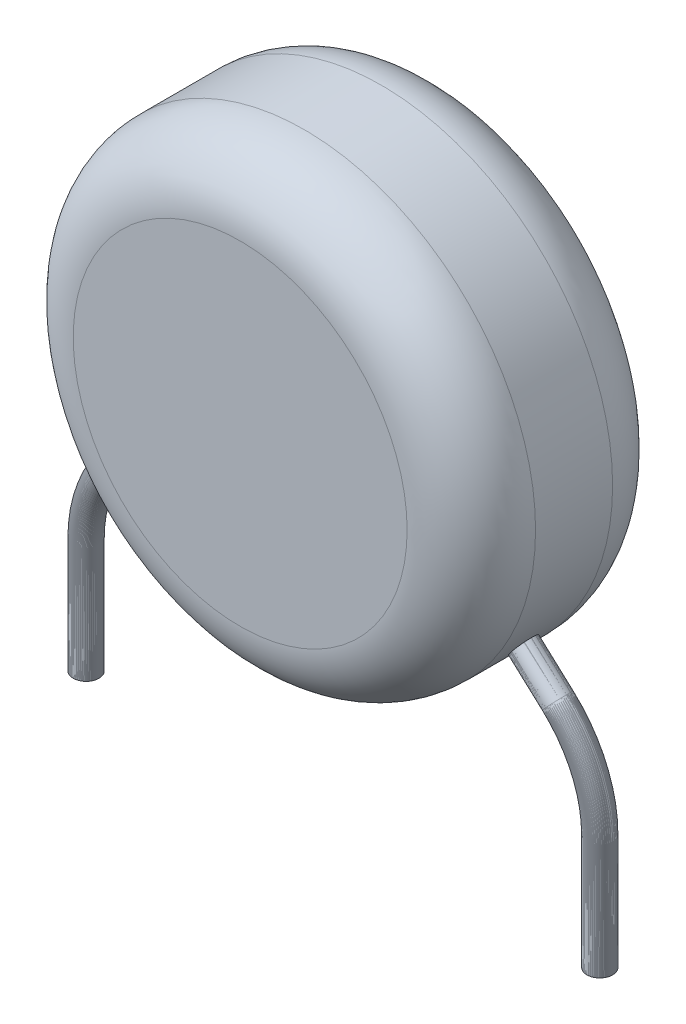
ISO-10303-21;
HEADER;
FILE_DESCRIPTION(('STEP AP214'),'2;1');
FILE_NAME('part.step','',(''),(''),'','','');
FILE_SCHEMA(('AUTOMOTIVE_DESIGN { 1 0 10303 214 1 1 1 1 }'));
ENDSEC;
DATA;
#1=APPLICATION_CONTEXT('core data for automotive mechanical design processes');
#2=APPLICATION_PROTOCOL_DEFINITION('international standard','automotive_design',2000,#1);
#3=PRODUCT_CONTEXT('',#1,'mechanical');
#4=PRODUCT('Part','Part','',(#3));
#5=PRODUCT_RELATED_PRODUCT_CATEGORY('part','',(#4));
#6=PRODUCT_DEFINITION_FORMATION('','',#4);
#7=PRODUCT_DEFINITION_CONTEXT('part definition',#1,'design');
#8=PRODUCT_DEFINITION('design','',#6,#7);
#9=PRODUCT_DEFINITION_SHAPE('','',#8);
#10=(LENGTH_UNIT() NAMED_UNIT(*) SI_UNIT(.MILLI.,.METRE.));
#11=(NAMED_UNIT(*) PLANE_ANGLE_UNIT() SI_UNIT($,.RADIAN.));
#12=(NAMED_UNIT(*) SI_UNIT($,.STERADIAN.) SOLID_ANGLE_UNIT());
#13=UNCERTAINTY_MEASURE_WITH_UNIT(LENGTH_MEASURE(1.E-05),#10,'distance_accuracy_value','');
#14=(GEOMETRIC_REPRESENTATION_CONTEXT(3) GLOBAL_UNCERTAINTY_ASSIGNED_CONTEXT((#13)) GLOBAL_UNIT_ASSIGNED_CONTEXT((#10,
#11,#12)) REPRESENTATION_CONTEXT('',''));
#15=CARTESIAN_POINT('',(0.,0.,0.));
#16=DIRECTION('',(0.,0.,1.));
#17=DIRECTION('',(1.,0.,0.));
#18=AXIS2_PLACEMENT_3D('',#15,#16,#17);
#19=CARTESIAN_POINT('',(10.,0.,0.));
#20=DIRECTION('',(0.,1.,0.));
#21=DIRECTION('',(0.,0.,1.));
#22=AXIS2_PLACEMENT_3D('',#19,#20,#21);
#23=CYLINDRICAL_SURFACE('',#22,0.500000000000001);
#24=CARTESIAN_POINT('',(10.,0.,0.));
#25=DIRECTION('',(0.,1.,0.));
#26=DIRECTION('',(0.,0.,1.));
#27=AXIS2_PLACEMENT_3D('',#24,#25,#26);
#28=CIRCLE('',#27,0.500000000000001);
#29=CARTESIAN_POINT('',(10.,0.,0.500000000000001));
#30=VERTEX_POINT('',#29);
#31=EDGE_CURVE('E49',#30,#30,#28,.T.);
#32=ORIENTED_EDGE('',*,*,#31,.T.);
#33=EDGE_LOOP('',(#32));
#34=FACE_BOUND('',#33,.T.);
#35=CARTESIAN_POINT('',(10.,4.48362223327964,0.));
#36=DIRECTION('',(0.,1.,0.));
#37=DIRECTION('',(0.,0.,1.));
#38=AXIS2_PLACEMENT_3D('',#35,#36,#37);
#39=CIRCLE('',#38,0.500000000000001);
#40=CARTESIAN_POINT('',(10.5,4.48362223327964,0.));
#41=VERTEX_POINT('',#40);
#42=EDGE_CURVE('E11',#41,#41,#39,.T.);
#43=ORIENTED_EDGE('',*,*,#42,.F.);
#44=EDGE_LOOP('',(#43));
#45=FACE_BOUND('',#44,.T.);
#46=ADVANCED_FACE('F42',(#34,#45),#23,.T.);
#47=CARTESIAN_POINT('',(5.,4.48362223327964,0.));
#48=DIRECTION('',(0.,0.,1.));
#49=DIRECTION('',(1.,0.,0.));
#50=AXIS2_PLACEMENT_3D('',#47,#48,#49);
#51=TOROIDAL_SURFACE('',#50,5.,0.500000000000001);
#52=CARTESIAN_POINT('',(8.36771550722866,8.17936197822538,0.));
#53=DIRECTION('',(-0.739147948989148,0.673543101445732,0.));
#54=DIRECTION('',(0.,0.,1.));
#55=AXIS2_PLACEMENT_3D('',#52,#53,#54);
#56=CIRCLE('',#55,0.500000000000001);
#57=CARTESIAN_POINT('',(8.70448705795153,8.54893595271996,0.));
#58=VERTEX_POINT('',#57);
#59=EDGE_CURVE('E55',#58,#58,#56,.T.);
#60=CARTESIAN_POINT('',(5.,4.48362223327964,0.));
#61=DIRECTION('',(0.,0.,1.));
#62=DIRECTION('',(1.,0.,0.));
#63=AXIS2_PLACEMENT_3D('',#60,#61,#62);
#64=CIRCLE('',#63,5.5);
#65=EDGE_CURVE('',#41,#58,#64,.T.);
#66=ORIENTED_EDGE('',*,*,#42,.T.);
#67=ORIENTED_EDGE('',*,*,#59,.F.);
#68=ORIENTED_EDGE('',*,*,#65,.T.);
#69=ORIENTED_EDGE('',*,*,#65,.F.);
#70=EDGE_LOOP('',(#66,#68,#67,#69));
#71=FACE_BOUND('',#70,.T.);
#72=ADVANCED_FACE('F111',(#71),#51,.T.);
#73=CARTESIAN_POINT('',(8.36771550722866,8.17936197822538,0.));
#74=DIRECTION('',(-0.739147948989148,0.673543101445732,0.));
#75=DIRECTION('',(-0.673543101445732,-0.739147948989148,0.));
#76=AXIS2_PLACEMENT_3D('',#73,#74,#75);
#77=CYLINDRICAL_SURFACE('',#76,0.500000000000001);
#78=ORIENTED_EDGE('',*,*,#59,.T.);
#79=EDGE_LOOP('',(#78));
#80=FACE_BOUND('',#79,.T.);
#81=CARTESIAN_POINT('',(2.49835212954527,13.5277759436884,0.));
#82=DIRECTION('',(-0.739147948989148,0.673543101445732,0.));
#83=DIRECTION('',(0.,0.,1.));
#84=AXIS2_PLACEMENT_3D('',#81,#82,#83);
#85=CIRCLE('',#84,0.500000000000001);
#86=CARTESIAN_POINT('',(2.83512368026814,13.8973499181829,0.));
#87=VERTEX_POINT('',#86);
#88=EDGE_CURVE('E60',#87,#87,#85,.T.);
#89=ORIENTED_EDGE('',*,*,#88,.F.);
#90=EDGE_LOOP('',(#89));
#91=FACE_BOUND('',#90,.T.);
#92=ADVANCED_FACE('F105',(#80,#91),#77,.T.);
#93=CARTESIAN_POINT('',(-0.869363377683391,9.83203619874261,0.));
#94=DIRECTION('',(0.,0.,1.));
#95=DIRECTION('',(1.,0.,0.));
#96=AXIS2_PLACEMENT_3D('',#93,#94,#95);
#97=TOROIDAL_SURFACE('',#96,5.,0.500000000000001);
#98=CARTESIAN_POINT('',(0.148992180179936,14.7272330239754,0.));
#99=DIRECTION('',(-0.979039365046551,0.203671111572666,0.));
#100=DIRECTION('',(0.,0.,1.));
#101=AXIS2_PLACEMENT_3D('',#98,#99,#100);
#102=CIRCLE('',#101,0.500000000000001);
#103=CARTESIAN_POINT('',(0.250827735966269,15.2167527064986,0.));
#104=VERTEX_POINT('',#103);
#105=EDGE_CURVE('E63',#104,#104,#102,.T.);
#106=CARTESIAN_POINT('',(-0.869363377683391,9.83203619874261,0.));
#107=DIRECTION('',(0.,0.,1.));
#108=DIRECTION('',(1.,0.,0.));
#109=AXIS2_PLACEMENT_3D('',#106,#107,#108);
#110=CIRCLE('',#109,5.5);
#111=EDGE_CURVE('',#87,#104,#110,.T.);
#112=ORIENTED_EDGE('',*,*,#88,.T.);
#113=ORIENTED_EDGE('',*,*,#105,.F.);
#114=ORIENTED_EDGE('',*,*,#111,.T.);
#115=ORIENTED_EDGE('',*,*,#111,.F.);
#116=EDGE_LOOP('',(#112,#114,#113,#115));
#117=FACE_BOUND('',#116,.T.);
#118=ADVANCED_FACE('F100',(#117),#97,.T.);
#119=CARTESIAN_POINT('',(0.,14.0110332234542,0.));
#120=DIRECTION('',(0.,0.,1.));
#121=DIRECTION('',(1.,0.,0.));
#122=AXIS2_PLACEMENT_3D('',#119,#120,#121);
#123=TOROIDAL_SURFACE('',#122,0.731533200901586,0.500000000000001);
#124=CARTESIAN_POINT('',(-0.148992180179935,14.7272330239754,0.));
#125=DIRECTION('',(-0.979039365046552,-0.203671111572664,0.));
#126=DIRECTION('',(0.,0.,1.));
#127=AXIS2_PLACEMENT_3D('',#124,#125,#126);
#128=CIRCLE('',#127,0.500000000000001);
#129=CARTESIAN_POINT('',(-0.250827735966267,15.2167527064986,0.));
#130=VERTEX_POINT('',#129);
#131=EDGE_CURVE('E66',#130,#130,#128,.T.);
#132=CARTESIAN_POINT('',(0.,14.0110332234542,0.));
#133=DIRECTION('',(0.,0.,1.));
#134=DIRECTION('',(1.,0.,0.));
#135=AXIS2_PLACEMENT_3D('',#132,#133,#134);
#136=CIRCLE('',#135,1.23153320090159);
#137=EDGE_CURVE('',#104,#130,#136,.T.);
#138=ORIENTED_EDGE('',*,*,#105,.T.);
#139=ORIENTED_EDGE('',*,*,#131,.F.);
#140=ORIENTED_EDGE('',*,*,#137,.T.);
#141=ORIENTED_EDGE('',*,*,#137,.F.);
#142=EDGE_LOOP('',(#138,#140,#139,#141));
#143=FACE_BOUND('',#142,.T.);
#144=ADVANCED_FACE('F94',(#143),#123,.T.);
#145=CARTESIAN_POINT('',(0.869363377683391,9.83203619874261,0.));
#146=DIRECTION('',(0.,0.,1.));
#147=DIRECTION('',(1.,0.,0.));
#148=AXIS2_PLACEMENT_3D('',#145,#146,#147);
#149=TOROIDAL_SURFACE('',#148,5.,0.500000000000001);
#150=CARTESIAN_POINT('',(-2.49835212954527,13.5277759436883,0.));
#151=DIRECTION('',(-0.739147948989149,-0.673543101445731,0.));
#152=DIRECTION('',(0.,0.,1.));
#153=AXIS2_PLACEMENT_3D('',#150,#151,#152);
#154=CIRCLE('',#153,0.500000000000001);
#155=CARTESIAN_POINT('',(-2.83512368026814,13.8973499181829,0.));
#156=VERTEX_POINT('',#155);
#157=EDGE_CURVE('E69',#156,#156,#154,.T.);
#158=CARTESIAN_POINT('',(0.869363377683391,9.83203619874261,0.));
#159=DIRECTION('',(0.,0.,1.));
#160=DIRECTION('',(1.,0.,0.));
#161=AXIS2_PLACEMENT_3D('',#158,#159,#160);
#162=CIRCLE('',#161,5.5);
#163=EDGE_CURVE('',#130,#156,#162,.T.);
#164=ORIENTED_EDGE('',*,*,#131,.T.);
#165=ORIENTED_EDGE('',*,*,#157,.F.);
#166=ORIENTED_EDGE('',*,*,#163,.T.);
#167=ORIENTED_EDGE('',*,*,#163,.F.);
#168=EDGE_LOOP('',(#164,#166,#165,#167));
#169=FACE_BOUND('',#168,.T.);
#170=ADVANCED_FACE('F90',(#169),#149,.T.);
#171=CARTESIAN_POINT('',(-2.49835212954527,13.5277759436883,0.));
#172=DIRECTION('',(-0.739147948989148,-0.673543101445732,0.));
#173=DIRECTION('',(0.673543101445732,-0.739147948989148,0.));
#174=AXIS2_PLACEMENT_3D('',#171,#172,#173);
#175=CYLINDRICAL_SURFACE('',#174,0.500000000000001);
#176=ORIENTED_EDGE('',*,*,#157,.T.);
#177=EDGE_LOOP('',(#176));
#178=FACE_BOUND('',#177,.T.);
#179=CARTESIAN_POINT('',(-8.36771550722866,8.17936197822538,0.));
#180=DIRECTION('',(-0.739147948989149,-0.673543101445731,0.));
#181=DIRECTION('',(0.,0.,1.));
#182=AXIS2_PLACEMENT_3D('',#179,#180,#181);
#183=CIRCLE('',#182,0.500000000000001);
#184=CARTESIAN_POINT('',(-8.70448705795152,8.54893595271995,0.));
#185=VERTEX_POINT('',#184);
#186=EDGE_CURVE('E72',#185,#185,#183,.T.);
#187=ORIENTED_EDGE('',*,*,#186,.F.);
#188=EDGE_LOOP('',(#187));
#189=FACE_BOUND('',#188,.T.);
#190=ADVANCED_FACE('F85',(#178,#189),#175,.T.);
#191=CARTESIAN_POINT('',(-5.,4.48362223327964,0.));
#192=DIRECTION('',(0.,0.,1.));
#193=DIRECTION('',(1.,0.,0.));
#194=AXIS2_PLACEMENT_3D('',#191,#192,#193);
#195=TOROIDAL_SURFACE('',#194,5.,0.500000000000001);
#196=CARTESIAN_POINT('',(-10.,4.48362223327964,0.));
#197=DIRECTION('',(0.,-1.,0.));
#198=DIRECTION('',(0.,0.,1.));
#199=AXIS2_PLACEMENT_3D('',#196,#197,#198);
#200=CIRCLE('',#199,0.500000000000001);
#201=CARTESIAN_POINT('',(-10.5,4.48362223327964,0.));
#202=VERTEX_POINT('',#201);
#203=EDGE_CURVE('E74',#202,#202,#200,.T.);
#204=CARTESIAN_POINT('',(-5.,4.48362223327964,0.));
#205=DIRECTION('',(0.,0.,1.));
#206=DIRECTION('',(1.,0.,0.));
#207=AXIS2_PLACEMENT_3D('',#204,#205,#206);
#208=CIRCLE('',#207,5.5);
#209=EDGE_CURVE('',#185,#202,#208,.T.);
#210=ORIENTED_EDGE('',*,*,#186,.T.);
#211=ORIENTED_EDGE('',*,*,#203,.F.);
#212=ORIENTED_EDGE('',*,*,#209,.T.);
#213=ORIENTED_EDGE('',*,*,#209,.F.);
#214=EDGE_LOOP('',(#210,#212,#211,#213));
#215=FACE_BOUND('',#214,.T.);
#216=ADVANCED_FACE('F43',(#215),#195,.T.);
#217=CARTESIAN_POINT('',(-10.,4.48362223327964,0.));
#218=DIRECTION('',(0.,-1.,0.));
#219=DIRECTION('',(1.,0.,0.));
#220=AXIS2_PLACEMENT_3D('',#217,#218,#219);
#221=CYLINDRICAL_SURFACE('',#220,0.500000000000001);
#222=ORIENTED_EDGE('',*,*,#203,.T.);
#223=EDGE_LOOP('',(#222));
#224=FACE_BOUND('',#223,.T.);
#225=CARTESIAN_POINT('',(-10.,0.,0.));
#226=DIRECTION('',(0.,-1.,0.));
#227=DIRECTION('',(0.,0.,1.));
#228=AXIS2_PLACEMENT_3D('',#225,#226,#227);
#229=CIRCLE('',#228,0.500000000000001);
#230=CARTESIAN_POINT('',(-10.,0.,0.500000000000001));
#231=VERTEX_POINT('',#230);
#232=EDGE_CURVE('E46',#231,#231,#229,.T.);
#233=ORIENTED_EDGE('',*,*,#232,.F.);
#234=EDGE_LOOP('',(#233));
#235=FACE_BOUND('',#234,.T.);
#236=ADVANCED_FACE('F44',(#224,#235),#221,.T.);
#237=OPEN_SHELL('',(#46,#72,#92,#118,#144,#170,#190,#216,#236));
#238=SHELL_BASED_SURFACE_MODEL('B2',(#237));
#239=CARTESIAN_POINT('',(-10.,0.,0.));
#240=DIRECTION('',(0.,1.,0.));
#241=DIRECTION('',(-1.,0.,0.));
#242=AXIS2_PLACEMENT_3D('',#239,#240,#241);
#243=CYLINDRICAL_SURFACE('',#242,0.500000000000001);
#244=CARTESIAN_POINT('',(-10.,0.,0.));
#245=DIRECTION('',(0.,1.,0.));
#246=DIRECTION('',(0.,0.,1.));
#247=AXIS2_PLACEMENT_3D('',#244,#245,#246);
#248=CIRCLE('',#247,0.500000000000001);
#249=CARTESIAN_POINT('',(-10.,0.,0.500000000000001));
#250=VERTEX_POINT('',#249);
#251=EDGE_CURVE('E202',#250,#250,#248,.T.);
#252=ORIENTED_EDGE('',*,*,#251,.T.);
#253=EDGE_LOOP('',(#252));
#254=FACE_BOUND('',#253,.T.);
#255=CARTESIAN_POINT('',(-10.,4.48362223327964,0.));
#256=DIRECTION('',(0.,1.,0.));
#257=DIRECTION('',(0.,0.,1.));
#258=AXIS2_PLACEMENT_3D('',#255,#256,#257);
#259=CIRCLE('',#258,0.500000000000001);
#260=CARTESIAN_POINT('',(-10.5,4.48362223327964,0.));
#261=VERTEX_POINT('',#260);
#262=EDGE_CURVE('E41',#261,#261,#259,.T.);
#263=ORIENTED_EDGE('',*,*,#262,.F.);
#264=EDGE_LOOP('',(#263));
#265=FACE_BOUND('',#264,.T.);
#266=ADVANCED_FACE('F195',(#254,#265),#243,.T.);
#267=CARTESIAN_POINT('',(-5.,4.48362223327964,0.));
#268=DIRECTION('',(0.,0.,-1.));
#269=DIRECTION('',(-1.,0.,0.));
#270=AXIS2_PLACEMENT_3D('',#267,#268,#269);
#271=TOROIDAL_SURFACE('',#270,5.,0.500000000000001);
#272=CARTESIAN_POINT('',(-8.36771550722866,8.17936197822538,0.));
#273=DIRECTION('',(0.739147948989148,0.673543101445732,0.));
#274=DIRECTION('',(0.,0.,1.));
#275=AXIS2_PLACEMENT_3D('',#272,#273,#274);
#276=CIRCLE('',#275,0.500000000000001);
#277=CARTESIAN_POINT('',(-8.70448705795152,8.54893595271996,0.));
#278=VERTEX_POINT('',#277);
#279=EDGE_CURVE('E208',#278,#278,#276,.T.);
#280=CARTESIAN_POINT('',(-5.,4.48362223327964,0.));
#281=DIRECTION('',(0.,0.,-1.));
#282=DIRECTION('',(-1.,0.,0.));
#283=AXIS2_PLACEMENT_3D('',#280,#281,#282);
#284=CIRCLE('',#283,5.5);
#285=EDGE_CURVE('',#261,#278,#284,.T.);
#286=ORIENTED_EDGE('',*,*,#262,.T.);
#287=ORIENTED_EDGE('',*,*,#279,.F.);
#288=ORIENTED_EDGE('',*,*,#285,.T.);
#289=ORIENTED_EDGE('',*,*,#285,.F.);
#290=EDGE_LOOP('',(#286,#288,#287,#289));
#291=FACE_BOUND('',#290,.T.);
#292=ADVANCED_FACE('F264',(#291),#271,.T.);
#293=CARTESIAN_POINT('',(-8.36771550722866,8.17936197822538,0.));
#294=DIRECTION('',(0.739147948989148,0.673543101445732,0.));
#295=DIRECTION('',(-0.673543101445732,0.739147948989148,0.));
#296=AXIS2_PLACEMENT_3D('',#293,#294,#295);
#297=CYLINDRICAL_SURFACE('',#296,0.500000000000001);
#298=ORIENTED_EDGE('',*,*,#279,.T.);
#299=EDGE_LOOP('',(#298));
#300=FACE_BOUND('',#299,.T.);
#301=CARTESIAN_POINT('',(-2.49835212954527,13.5277759436884,0.));
#302=DIRECTION('',(0.739147948989148,0.673543101445732,0.));
#303=DIRECTION('',(0.,0.,1.));
#304=AXIS2_PLACEMENT_3D('',#301,#302,#303);
#305=CIRCLE('',#304,0.500000000000001);
#306=CARTESIAN_POINT('',(-2.83512368026814,13.8973499181829,0.));
#307=VERTEX_POINT('',#306);
#308=EDGE_CURVE('E213',#307,#307,#305,.T.);
#309=ORIENTED_EDGE('',*,*,#308,.F.);
#310=EDGE_LOOP('',(#309));
#311=FACE_BOUND('',#310,.T.);
#312=ADVANCED_FACE('F258',(#300,#311),#297,.T.);
#313=CARTESIAN_POINT('',(0.869363377683391,9.83203619874261,0.));
#314=DIRECTION('',(0.,0.,-1.));
#315=DIRECTION('',(-1.,0.,0.));
#316=AXIS2_PLACEMENT_3D('',#313,#314,#315);
#317=TOROIDAL_SURFACE('',#316,5.,0.500000000000001);
#318=CARTESIAN_POINT('',(-0.148992180179934,14.7272330239754,0.));
#319=DIRECTION('',(0.979039365046552,0.203671111572665,0.));
#320=DIRECTION('',(0.,0.,1.));
#321=AXIS2_PLACEMENT_3D('',#318,#319,#320);
#322=CIRCLE('',#321,0.500000000000001);
#323=CARTESIAN_POINT('',(-0.250827735966266,15.2167527064986,0.));
#324=VERTEX_POINT('',#323);
#325=EDGE_CURVE('E216',#324,#324,#322,.T.);
#326=CARTESIAN_POINT('',(0.869363377683391,9.83203619874261,0.));
#327=DIRECTION('',(0.,0.,-1.));
#328=DIRECTION('',(-1.,0.,0.));
#329=AXIS2_PLACEMENT_3D('',#326,#327,#328);
#330=CIRCLE('',#329,5.5);
#331=EDGE_CURVE('',#307,#324,#330,.T.);
#332=ORIENTED_EDGE('',*,*,#308,.T.);
#333=ORIENTED_EDGE('',*,*,#325,.F.);
#334=ORIENTED_EDGE('',*,*,#331,.T.);
#335=ORIENTED_EDGE('',*,*,#331,.F.);
#336=EDGE_LOOP('',(#332,#334,#333,#335));
#337=FACE_BOUND('',#336,.T.);
#338=ADVANCED_FACE('F253',(#337),#317,.T.);
#339=CARTESIAN_POINT('',(0.,14.0110332234542,0.));
#340=DIRECTION('',(0.,0.,-1.));
#341=DIRECTION('',(-1.,0.,0.));
#342=AXIS2_PLACEMENT_3D('',#339,#340,#341);
#343=TOROIDAL_SURFACE('',#342,0.731533200901589,0.500000000000001);
#344=CARTESIAN_POINT('',(0.148992180179938,14.7272330239754,0.));
#345=DIRECTION('',(0.979039365046552,-0.203671111572664,0.));
#346=DIRECTION('',(0.,0.,1.));
#347=AXIS2_PLACEMENT_3D('',#344,#345,#346);
#348=CIRCLE('',#347,0.500000000000001);
#349=CARTESIAN_POINT('',(0.250827735966273,15.2167527064986,0.));
#350=VERTEX_POINT('',#349);
#351=EDGE_CURVE('E219',#350,#350,#348,.T.);
#352=CARTESIAN_POINT('',(0.,14.0110332234542,0.));
#353=DIRECTION('',(0.,0.,-1.));
#354=DIRECTION('',(-1.,0.,0.));
#355=AXIS2_PLACEMENT_3D('',#352,#353,#354);
#356=CIRCLE('',#355,1.23153320090159);
#357=EDGE_CURVE('',#324,#350,#356,.T.);
#358=ORIENTED_EDGE('',*,*,#325,.T.);
#359=ORIENTED_EDGE('',*,*,#351,.F.);
#360=ORIENTED_EDGE('',*,*,#357,.T.);
#361=ORIENTED_EDGE('',*,*,#357,.F.);
#362=EDGE_LOOP('',(#358,#360,#359,#361));
#363=FACE_BOUND('',#362,.T.);
#364=ADVANCED_FACE('F247',(#363),#343,.T.);
#365=CARTESIAN_POINT('',(-0.869363377683391,9.83203619874261,0.));
#366=DIRECTION('',(0.,0.,-1.));
#367=DIRECTION('',(-1.,0.,0.));
#368=AXIS2_PLACEMENT_3D('',#365,#366,#367);
#369=TOROIDAL_SURFACE('',#368,5.,0.500000000000001);
#370=CARTESIAN_POINT('',(2.49835212954527,13.5277759436883,0.));
#371=DIRECTION('',(0.739147948989149,-0.673543101445731,0.));
#372=DIRECTION('',(0.,0.,1.));
#373=AXIS2_PLACEMENT_3D('',#370,#371,#372);
#374=CIRCLE('',#373,0.500000000000001);
#375=CARTESIAN_POINT('',(2.83512368026814,13.8973499181829,0.));
#376=VERTEX_POINT('',#375);
#377=EDGE_CURVE('E222',#376,#376,#374,.T.);
#378=CARTESIAN_POINT('',(-0.869363377683391,9.83203619874261,0.));
#379=DIRECTION('',(0.,0.,-1.));
#380=DIRECTION('',(-1.,0.,0.));
#381=AXIS2_PLACEMENT_3D('',#378,#379,#380);
#382=CIRCLE('',#381,5.5);
#383=EDGE_CURVE('',#350,#376,#382,.T.);
#384=ORIENTED_EDGE('',*,*,#351,.T.);
#385=ORIENTED_EDGE('',*,*,#377,.F.);
#386=ORIENTED_EDGE('',*,*,#383,.T.);
#387=ORIENTED_EDGE('',*,*,#383,.F.);
#388=EDGE_LOOP('',(#384,#386,#385,#387));
#389=FACE_BOUND('',#388,.T.);
#390=ADVANCED_FACE('F243',(#389),#369,.T.);
#391=CARTESIAN_POINT('',(2.49835212954527,13.5277759436883,0.));
#392=DIRECTION('',(0.739147948989148,-0.673543101445732,0.));
#393=DIRECTION('',(0.673543101445732,0.739147948989148,0.));
#394=AXIS2_PLACEMENT_3D('',#391,#392,#393);
#395=CYLINDRICAL_SURFACE('',#394,0.500000000000001);
#396=CARTESIAN_POINT('',(8.36771550722866,8.17936197822538,0.));
#397=DIRECTION('',(0.739147948989149,-0.673543101445731,0.));
#398=DIRECTION('',(0.,0.,1.));
#399=AXIS2_PLACEMENT_3D('',#396,#397,#398);
#400=CIRCLE('',#399,0.500000000000001);
#401=CARTESIAN_POINT('',(8.70448705795153,8.54893595271996,0.));
#402=VERTEX_POINT('',#401);
#403=EDGE_CURVE('E225',#402,#402,#400,.T.);
#404=CARTESIAN_POINT('',(2.83512368026814,13.8973499181829,0.));
#405=CARTESIAN_POINT('',(2.89626288211901,13.8416372727094,0.));
#406=CARTESIAN_POINT('',(2.95740208396987,13.7859246272358,0.));
#407=CARTESIAN_POINT('',(3.07968048767161,13.6744993362886,0.));
#408=CARTESIAN_POINT('',(3.14081968952248,13.6187866908151,0.));
#409=CARTESIAN_POINT('',(3.26309809322422,13.5073613998679,0.));
#410=CARTESIAN_POINT('',(3.32423729507509,13.4516487543943,0.));
#411=CARTESIAN_POINT('',(3.44651569877682,13.3402234634472,0.));
#412=CARTESIAN_POINT('',(3.50765490062769,13.2845108179736,0.));
#413=CARTESIAN_POINT('',(3.62993330432943,13.1730855270265,0.));
#414=CARTESIAN_POINT('',(3.6910725061803,13.1173728815529,0.));
#415=CARTESIAN_POINT('',(3.81335090988203,13.0059475906058,0.));
#416=CARTESIAN_POINT('',(3.8744901117329,12.9502349451322,0.));
#417=CARTESIAN_POINT('',(3.99676851543464,12.838809654185,0.));
#418=CARTESIAN_POINT('',(4.05790771728551,12.7830970087115,0.));
#419=CARTESIAN_POINT('',(4.18018612098725,12.6716717177643,0.));
#420=CARTESIAN_POINT('',(4.24132532283812,12.6159590722908,0.));
#421=CARTESIAN_POINT('',(4.36360372653985,12.5045337813436,0.));
#422=CARTESIAN_POINT('',(4.42474292839072,12.44882113587,0.));
#423=CARTESIAN_POINT('',(4.54702133209246,12.3373958449229,0.));
#424=CARTESIAN_POINT('',(4.60816053394333,12.2816831994493,0.));
#425=CARTESIAN_POINT('',(4.73043893764507,12.1702579085022,0.));
#426=CARTESIAN_POINT('',(4.79157813949593,12.1145452630286,0.));
#427=CARTESIAN_POINT('',(4.91385654319767,12.0031199720815,0.));
#428=CARTESIAN_POINT('',(4.97499574504854,11.9474073266079,0.));
#429=CARTESIAN_POINT('',(5.09727414875028,11.8359820356607,0.));
#430=CARTESIAN_POINT('',(5.15841335060114,11.7802693901872,0.));
#431=CARTESIAN_POINT('',(5.28069175430288,11.66884409924,0.));
#432=CARTESIAN_POINT('',(5.34183095615375,11.6131314537664,0.));
#433=CARTESIAN_POINT('',(5.46410935985549,11.5017061628193,0.));
#434=CARTESIAN_POINT('',(5.52524856170636,11.4459935173457,0.));
#435=CARTESIAN_POINT('',(5.64752696540809,11.3345682263986,0.));
#436=CARTESIAN_POINT('',(5.70866616725896,11.278855580925,0.));
#437=CARTESIAN_POINT('',(5.8309445709607,11.1674302899779,0.));
#438=CARTESIAN_POINT('',(5.89208377281157,11.1117176445043,0.));
#439=CARTESIAN_POINT('',(6.01436217651331,11.0002923535571,0.));
#440=CARTESIAN_POINT('',(6.07550137836417,10.9445797080836,0.));
#441=CARTESIAN_POINT('',(6.19777978206591,10.8331544171364,0.));
#442=CARTESIAN_POINT('',(6.25891898391678,10.7774417716629,0.));
#443=CARTESIAN_POINT('',(6.38119738761852,10.6660164807157,0.));
#444=CARTESIAN_POINT('',(6.44233658946939,10.6103038352421,0.));
#445=CARTESIAN_POINT('',(6.56461499317112,10.498878544295,0.));
#446=CARTESIAN_POINT('',(6.62575419502199,10.4431658988214,0.));
#447=CARTESIAN_POINT('',(6.74803259872373,10.3317406078743,0.));
#448=CARTESIAN_POINT('',(6.8091718005746,10.2760279624007,0.));
#449=CARTESIAN_POINT('',(6.93145020427634,10.1646026714536,0.));
#450=CARTESIAN_POINT('',(6.9925894061272,10.10889002598,0.));
#451=CARTESIAN_POINT('',(7.11486780982894,9.99746473503284,0.));
#452=CARTESIAN_POINT('',(7.17600701167981,9.94175208955927,0.));
#453=CARTESIAN_POINT('',(7.29828541538155,9.83032679861213,0.));
#454=CARTESIAN_POINT('',(7.35942461723242,9.77461415313855,0.));
#455=CARTESIAN_POINT('',(7.48170302093415,9.66318886219141,0.));
#456=CARTESIAN_POINT('',(7.54284222278502,9.60747621671784,0.));
#457=CARTESIAN_POINT('',(7.66512062648676,9.49605092577069,0.));
#458=CARTESIAN_POINT('',(7.72625982833763,9.44033828029712,0.));
#459=CARTESIAN_POINT('',(7.84853823203937,9.32891298934997,0.));
#460=CARTESIAN_POINT('',(7.90967743389023,9.2732003438764,0.));
#461=CARTESIAN_POINT('',(8.03195583759197,9.16177505292925,0.));
#462=CARTESIAN_POINT('',(8.09309503944284,9.10606240745568,0.));
#463=CARTESIAN_POINT('',(8.21537344314458,8.99463711650854,0.));
#464=CARTESIAN_POINT('',(8.27651264499545,8.93892447103497,0.));
#465=CARTESIAN_POINT('',(8.39879104869718,8.82749918008782,0.));
#466=CARTESIAN_POINT('',(8.45993025054805,8.77178653461425,0.));
#467=CARTESIAN_POINT('',(8.58220865424979,8.6603612436671,0.));
#468=CARTESIAN_POINT('',(8.64334785610066,8.60464859819353,0.));
#469=CARTESIAN_POINT('',(8.70448705795153,8.54893595271996,0.));
#470=B_SPLINE_CURVE_WITH_KNOTS('',3,(#404,#405,#406,#407,#408,#409,#410,#411,#412,#413,#414,
#415,#416,#417,#418,#419,#420,#421,#422,#423,#424,#425,#426,#427,#428,#429,#430,#431,#432,#433,
#434,#435,#436,#437,#438,#439,#440,#441,#442,#443,#444,#445,#446,#447,#448,#449,#450,#451,#452,
#453,#454,#455,#456,#457,#458,#459,#460,#461,#462,#463,#464,#465,#466,#467,#468,#469),
.UNSPECIFIED.,.F.,.F.,(4,2,2,2,2,2,2,2,2,2,2,2,2,2,2,2,2,2,2,2,2,2,2,2,2,2,2,2,2,2,2,2,4),(0.,
0.248147351018758,0.496294702037518,0.744442053056277,0.992589404075035,1.24073675509379,
1.48888410611255,1.73703145713131,1.98517880815007,2.23332615916883,2.48147351018759,
2.72962086120635,2.97776821222511,3.22591556324387,3.47406291426263,3.72221026528139,
3.97035761630015,4.2185049673189,4.46665231833766,4.71479966935642,4.96294702037518,
5.21109437139394,5.4592417224127,5.70738907343146,5.95553642445022,6.20368377546898,
6.45183112648774,6.69997847750649,6.94812582852525,7.19627317954401,7.44442053056277,
7.69256788158153,7.94071523260029),.UNSPECIFIED.);
#471=EDGE_CURVE('BSEAM238',#376,#402,#470,.T.);
#472=ORIENTED_EDGE('',*,*,#377,.T.);
#473=ORIENTED_EDGE('',*,*,#403,.F.);
#474=ORIENTED_EDGE('',*,*,#471,.T.);
#475=ORIENTED_EDGE('',*,*,#471,.F.);
#476=EDGE_LOOP('',(#472,#474,#473,#475));
#477=FACE_BOUND('',#476,.T.);
#478=ADVANCED_FACE('F238',(#477),#395,.T.);
#479=CARTESIAN_POINT('',(5.,4.48362223327964,0.));
#480=DIRECTION('',(0.,0.,-1.));
#481=DIRECTION('',(-1.,0.,0.));
#482=AXIS2_PLACEMENT_3D('',#479,#480,#481);
#483=TOROIDAL_SURFACE('',#482,5.,0.500000000000001);
#484=CARTESIAN_POINT('',(10.,4.48362223327964,0.));
#485=DIRECTION('',(0.,-1.,0.));
#486=DIRECTION('',(0.,0.,1.));
#487=AXIS2_PLACEMENT_3D('',#484,#485,#486);
#488=CIRCLE('',#487,0.500000000000001);
#489=CARTESIAN_POINT('',(10.5,4.48362223327964,0.));
#490=VERTEX_POINT('',#489);
#491=EDGE_CURVE('E227',#490,#490,#488,.T.);
#492=CARTESIAN_POINT('',(5.,4.48362223327964,0.));
#493=DIRECTION('',(0.,0.,-1.));
#494=DIRECTION('',(-1.,0.,0.));
#495=AXIS2_PLACEMENT_3D('',#492,#493,#494);
#496=CIRCLE('',#495,5.5);
#497=EDGE_CURVE('',#402,#490,#496,.T.);
#498=ORIENTED_EDGE('',*,*,#403,.T.);
#499=ORIENTED_EDGE('',*,*,#491,.F.);
#500=ORIENTED_EDGE('',*,*,#497,.T.);
#501=ORIENTED_EDGE('',*,*,#497,.F.);
#502=EDGE_LOOP('',(#498,#500,#499,#501));
#503=FACE_BOUND('',#502,.T.);
#504=ADVANCED_FACE('F196',(#503),#483,.T.);
#505=CARTESIAN_POINT('',(10.,4.48362223327964,0.));
#506=DIRECTION('',(0.,-1.,0.));
#507=DIRECTION('',(0.,0.,-1.));
#508=AXIS2_PLACEMENT_3D('',#505,#506,#507);
#509=CYLINDRICAL_SURFACE('',#508,0.500000000000001);
#510=ORIENTED_EDGE('',*,*,#491,.T.);
#511=EDGE_LOOP('',(#510));
#512=FACE_BOUND('',#511,.T.);
#513=CARTESIAN_POINT('',(10.,0.,0.));
#514=DIRECTION('',(0.,-1.,0.));
#515=DIRECTION('',(0.,0.,1.));
#516=AXIS2_PLACEMENT_3D('',#513,#514,#515);
#517=CIRCLE('',#516,0.500000000000001);
#518=CARTESIAN_POINT('',(10.,0.,0.500000000000001));
#519=VERTEX_POINT('',#518);
#520=EDGE_CURVE('E199',#519,#519,#517,.T.);
#521=ORIENTED_EDGE('',*,*,#520,.F.);
#522=EDGE_LOOP('',(#521));
#523=FACE_BOUND('',#522,.T.);
#524=ADVANCED_FACE('F197',(#512,#523),#509,.T.);
#525=OPEN_SHELL('',(#266,#292,#312,#338,#364,#390,#478,#504,#524));
#526=SHELL_BASED_SURFACE_MODEL('B6',(#525));
#527=CARTESIAN_POINT('',(10.,4.48,0.));
#528=DIRECTION('',(0.,-1.,0.));
#529=DIRECTION('',(0.,0.,-1.));
#530=AXIS2_PLACEMENT_3D('',#527,#528,#529);
#531=CYLINDRICAL_SURFACE('',#530,0.500000000000001);
#532=CARTESIAN_POINT('',(10.,4.48,0.));
#533=DIRECTION('',(0.,1.,0.));
#534=DIRECTION('',(0.,0.,1.));
#535=AXIS2_PLACEMENT_3D('',#532,#533,#534);
#536=CIRCLE('',#535,0.500000000000001);
#537=CARTESIAN_POINT('',(10.,4.48,0.500000000000001));
#538=VERTEX_POINT('',#537);
#539=EDGE_CURVE('E194',#538,#538,#536,.T.);
#540=ORIENTED_EDGE('',*,*,#539,.F.);
#541=EDGE_LOOP('',(#540));
#542=FACE_BOUND('',#541,.T.);
#543=CARTESIAN_POINT('',(10.,0.,0.));
#544=DIRECTION('',(0.,1.,0.));
#545=DIRECTION('',(0.,0.,1.));
#546=AXIS2_PLACEMENT_3D('',#543,#544,#545);
#547=CIRCLE('',#546,0.500000000000001);
#548=CARTESIAN_POINT('',(10.,0.,0.500000000000001));
#549=VERTEX_POINT('',#548);
#550=EDGE_CURVE('E351',#549,#549,#547,.T.);
#551=ORIENTED_EDGE('',*,*,#550,.T.);
#552=EDGE_LOOP('',(#551));
#553=FACE_BOUND('',#552,.T.);
#554=ADVANCED_FACE('F348',(#542,#553),#531,.T.);
#555=CARTESIAN_POINT('',(10.,4.48,0.));
#556=DIRECTION('',(0.,1.,0.));
#557=DIRECTION('',(0.,0.,1.));
#558=AXIS2_PLACEMENT_3D('',#555,#556,#557);
#559=PLANE('',#558);
#560=ORIENTED_EDGE('',*,*,#539,.T.);
#561=EDGE_LOOP('',(#560));
#562=FACE_BOUND('',#561,.T.);
#563=ADVANCED_FACE('F363',(#562),#559,.T.);
#564=CARTESIAN_POINT('',(10.,0.,0.));
#565=DIRECTION('',(0.,1.,0.));
#566=DIRECTION('',(0.,0.,1.));
#567=AXIS2_PLACEMENT_3D('',#564,#565,#566);
#568=PLANE('',#567);
#569=ORIENTED_EDGE('',*,*,#550,.F.);
#570=EDGE_LOOP('',(#569));
#571=FACE_BOUND('',#570,.T.);
#572=ADVANCED_FACE('F361',(#571),#568,.F.);
#573=CLOSED_SHELL('',(#554,#563,#572));
#574=MANIFOLD_SOLID_BREP('B36',#573);
#575=CARTESIAN_POINT('',(-10.,4.48,0.));
#576=DIRECTION('',(0.,-1.,0.));
#577=DIRECTION('',(0.,0.,-1.));
#578=AXIS2_PLACEMENT_3D('',#575,#576,#577);
#579=CYLINDRICAL_SURFACE('',#578,0.500000000000001);
#580=CARTESIAN_POINT('',(-10.,4.48,0.));
#581=DIRECTION('',(0.,1.,0.));
#582=DIRECTION('',(0.,0.,1.));
#583=AXIS2_PLACEMENT_3D('',#580,#581,#582);
#584=CIRCLE('',#583,0.500000000000001);
#585=CARTESIAN_POINT('',(-10.,4.48,0.500000000000001));
#586=VERTEX_POINT('',#585);
#587=EDGE_CURVE('E347',#586,#586,#584,.T.);
#588=ORIENTED_EDGE('',*,*,#587,.F.);
#589=EDGE_LOOP('',(#588));
#590=FACE_BOUND('',#589,.T.);
#591=CARTESIAN_POINT('',(-10.,0.,0.));
#592=DIRECTION('',(0.,1.,0.));
#593=DIRECTION('',(0.,0.,1.));
#594=AXIS2_PLACEMENT_3D('',#591,#592,#593);
#595=CIRCLE('',#594,0.500000000000001);
#596=CARTESIAN_POINT('',(-10.,0.,0.500000000000001));
#597=VERTEX_POINT('',#596);
#598=EDGE_CURVE('E399',#597,#597,#595,.T.);
#599=ORIENTED_EDGE('',*,*,#598,.T.);
#600=EDGE_LOOP('',(#599));
#601=FACE_BOUND('',#600,.T.);
#602=ADVANCED_FACE('F396',(#590,#601),#579,.T.);
#603=CARTESIAN_POINT('',(-10.,4.48,0.));
#604=DIRECTION('',(0.,1.,0.));
#605=DIRECTION('',(0.,0.,1.));
#606=AXIS2_PLACEMENT_3D('',#603,#604,#605);
#607=PLANE('',#606);
#608=ORIENTED_EDGE('',*,*,#587,.T.);
#609=EDGE_LOOP('',(#608));
#610=FACE_BOUND('',#609,.T.);
#611=ADVANCED_FACE('F411',(#610),#607,.T.);
#612=CARTESIAN_POINT('',(-10.,0.,0.));
#613=DIRECTION('',(0.,1.,0.));
#614=DIRECTION('',(0.,0.,1.));
#615=AXIS2_PLACEMENT_3D('',#612,#613,#614);
#616=PLANE('',#615);
#617=ORIENTED_EDGE('',*,*,#598,.F.);
#618=EDGE_LOOP('',(#617));
#619=FACE_BOUND('',#618,.T.);
#620=ADVANCED_FACE('F409',(#619),#616,.F.);
#621=CLOSED_SHELL('',(#602,#611,#620));
#622=MANIFOLD_SOLID_BREP('B189',#621);
#623=CARTESIAN_POINT('',(0.,15.,-4.));
#624=DIRECTION('',(0.,0.,1.));
#625=DIRECTION('',(1.,0.,0.));
#626=AXIS2_PLACEMENT_3D('',#623,#624,#625);
#627=CYLINDRICAL_SURFACE('',#626,9.);
#628=CARTESIAN_POINT('',(0.,15.,-1.5));
#629=DIRECTION('',(0.,0.,1.));
#630=DIRECTION('',(1.,0.,0.));
#631=AXIS2_PLACEMENT_3D('',#628,#629,#630);
#632=CIRCLE('',#631,9.);
#633=CARTESIAN_POINT('',(9.,15.,-1.5));
#634=VERTEX_POINT('',#633);
#635=EDGE_CURVE('E448',#634,#634,#632,.T.);
#636=ORIENTED_EDGE('',*,*,#635,.T.);
#637=EDGE_LOOP('',(#636));
#638=FACE_BOUND('',#637,.T.);
#639=CARTESIAN_POINT('',(0.,15.,1.5));
#640=DIRECTION('',(0.,0.,1.));
#641=DIRECTION('',(1.,0.,0.));
#642=AXIS2_PLACEMENT_3D('',#639,#640,#641);
#643=CIRCLE('',#642,9.);
#644=CARTESIAN_POINT('',(9.,15.,1.5));
#645=VERTEX_POINT('',#644);
#646=EDGE_CURVE('E452',#645,#645,#643,.F.);
#647=ORIENTED_EDGE('',*,*,#646,.T.);
#648=EDGE_LOOP('',(#647));
#649=FACE_BOUND('',#648,.T.);
#650=ADVANCED_FACE('F437',(#638,#649),#627,.T.);
#651=CARTESIAN_POINT('',(0.,15.,-4.));
#652=DIRECTION('',(0.,0.,1.));
#653=DIRECTION('',(1.,0.,0.));
#654=AXIS2_PLACEMENT_3D('',#651,#652,#653);
#655=PLANE('',#654);
#656=CARTESIAN_POINT('',(0.,15.,-4.));
#657=DIRECTION('',(0.,0.,1.));
#658=DIRECTION('',(1.,0.,0.));
#659=AXIS2_PLACEMENT_3D('',#656,#657,#658);
#660=CIRCLE('',#659,6.5);
#661=CARTESIAN_POINT('',(6.5,15.,-4.));
#662=VERTEX_POINT('',#661);
#663=EDGE_CURVE('E444',#662,#662,#660,.F.);
#664=ORIENTED_EDGE('',*,*,#663,.T.);
#665=EDGE_LOOP('',(#664));
#666=FACE_BOUND('',#665,.T.);
#667=ADVANCED_FACE('F468',(#666),#655,.F.);
#668=CARTESIAN_POINT('',(0.,15.,4.));
#669=DIRECTION('',(0.,0.,1.));
#670=DIRECTION('',(1.,0.,0.));
#671=AXIS2_PLACEMENT_3D('',#668,#669,#670);
#672=PLANE('',#671);
#673=CARTESIAN_POINT('',(0.,15.,4.));
#674=DIRECTION('',(0.,0.,1.));
#675=DIRECTION('',(1.,0.,0.));
#676=AXIS2_PLACEMENT_3D('',#673,#674,#675);
#677=CIRCLE('',#676,6.5);
#678=CARTESIAN_POINT('',(6.5,15.,4.));
#679=VERTEX_POINT('',#678);
#680=EDGE_CURVE('E395',#679,#679,#677,.T.);
#681=ORIENTED_EDGE('',*,*,#680,.T.);
#682=EDGE_LOOP('',(#681));
#683=FACE_BOUND('',#682,.T.);
#684=ADVANCED_FACE('F465',(#683),#672,.T.);
#685=CARTESIAN_POINT('',(0.,15.,-1.5));
#686=DIRECTION('',(0.,0.,1.));
#687=DIRECTION('',(1.,0.,0.));
#688=AXIS2_PLACEMENT_3D('',#685,#686,#687);
#689=TOROIDAL_SURFACE('',#688,6.5,2.5);
#690=ORIENTED_EDGE('',*,*,#663,.F.);
#691=EDGE_LOOP('',(#690));
#692=FACE_BOUND('',#691,.T.);
#693=ORIENTED_EDGE('',*,*,#635,.F.);
#694=EDGE_LOOP('',(#693));
#695=FACE_BOUND('',#694,.T.);
#696=ADVANCED_FACE('F461',(#692,#695),#689,.T.);
#697=CARTESIAN_POINT('',(0.,15.,1.5));
#698=DIRECTION('',(0.,0.,1.));
#699=DIRECTION('',(1.,0.,0.));
#700=AXIS2_PLACEMENT_3D('',#697,#698,#699);
#701=TOROIDAL_SURFACE('',#700,6.5,2.5);
#702=ORIENTED_EDGE('',*,*,#646,.F.);
#703=EDGE_LOOP('',(#702));
#704=FACE_BOUND('',#703,.T.);
#705=ORIENTED_EDGE('',*,*,#680,.F.);
#706=EDGE_LOOP('',(#705));
#707=FACE_BOUND('',#706,.T.);
#708=ADVANCED_FACE('F439',(#704,#707),#701,.T.);
#709=CLOSED_SHELL('',(#650,#667,#684,#696,#708));
#710=MANIFOLD_SOLID_BREP('B342',#709);
#711=ADVANCED_BREP_SHAPE_REPRESENTATION('',(#18,#574,#622,#710),#14);
#712=MANIFOLD_SURFACE_SHAPE_REPRESENTATION('',(#18,#238,#526),#14);
#713=SHAPE_REPRESENTATION('',(#18),#14);
#714=SHAPE_DEFINITION_REPRESENTATION(#9,#713);
#715=SHAPE_REPRESENTATION_RELATIONSHIP('','',#713,#711);
#716=SHAPE_REPRESENTATION_RELATIONSHIP('','',#713,#712);
ENDSEC;
END-ISO-10303-21;
